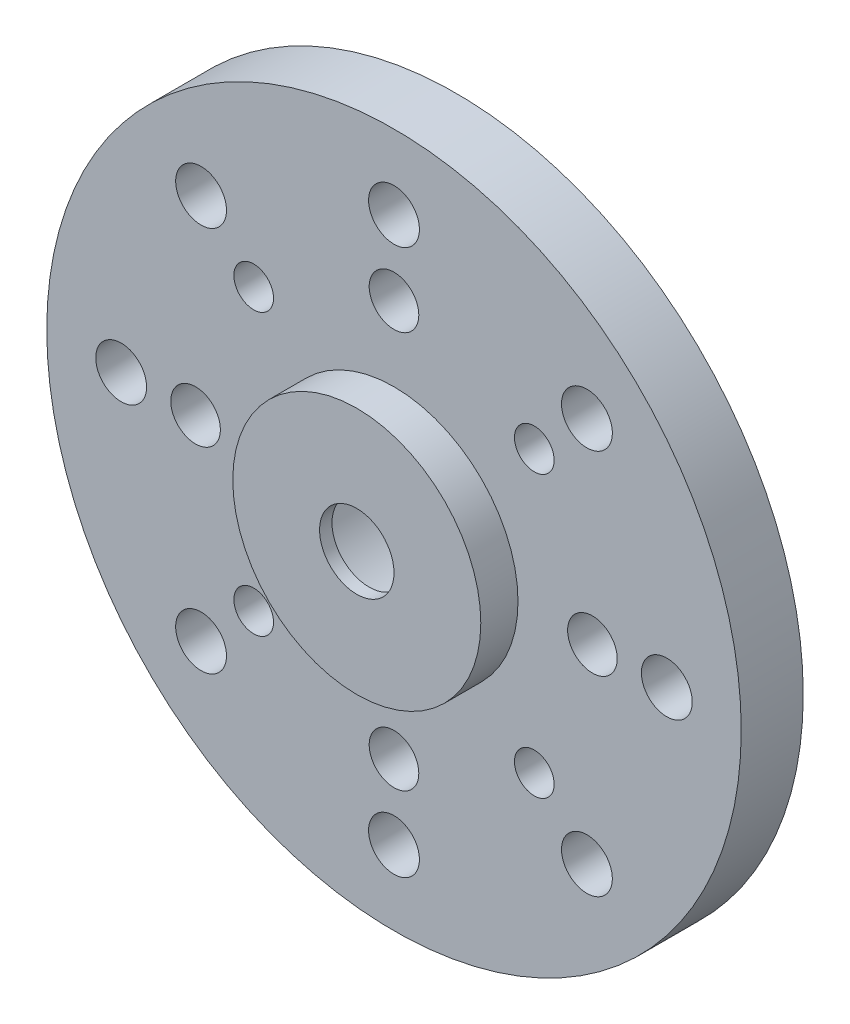
ISO-10303-21;
HEADER;
FILE_DESCRIPTION(('STEP AP214'),'2;1');
FILE_NAME('part.step','',(''),(''),'','','');
FILE_SCHEMA(('AUTOMOTIVE_DESIGN { 1 0 10303 214 1 1 1 1 }'));
ENDSEC;
DATA;
#1=APPLICATION_CONTEXT('core data for automotive mechanical design processes');
#2=APPLICATION_PROTOCOL_DEFINITION('international standard','automotive_design',2000,#1);
#3=PRODUCT_CONTEXT('',#1,'mechanical');
#4=PRODUCT('Part','Part','',(#3));
#5=PRODUCT_RELATED_PRODUCT_CATEGORY('part','',(#4));
#6=PRODUCT_DEFINITION_FORMATION('','',#4);
#7=PRODUCT_DEFINITION_CONTEXT('part definition',#1,'design');
#8=PRODUCT_DEFINITION('design','',#6,#7);
#9=PRODUCT_DEFINITION_SHAPE('','',#8);
#10=(LENGTH_UNIT() NAMED_UNIT(*) SI_UNIT(.MILLI.,.METRE.));
#11=(NAMED_UNIT(*) PLANE_ANGLE_UNIT() SI_UNIT($,.RADIAN.));
#12=(NAMED_UNIT(*) SI_UNIT($,.STERADIAN.) SOLID_ANGLE_UNIT());
#13=UNCERTAINTY_MEASURE_WITH_UNIT(LENGTH_MEASURE(1.E-05),#10,'distance_accuracy_value','');
#14=(GEOMETRIC_REPRESENTATION_CONTEXT(3) GLOBAL_UNCERTAINTY_ASSIGNED_CONTEXT((#13)) GLOBAL_UNIT_ASSIGNED_CONTEXT((#10,
#11,#12)) REPRESENTATION_CONTEXT('',''));
#15=CARTESIAN_POINT('',(0.,0.,0.));
#16=DIRECTION('',(0.,0.,1.));
#17=DIRECTION('',(1.,0.,0.));
#18=AXIS2_PLACEMENT_3D('',#15,#16,#17);
#19=CARTESIAN_POINT('',(0.,0.,25.));
#20=DIRECTION('',(0.,0.,1.));
#21=DIRECTION('',(1.,0.,0.));
#22=AXIS2_PLACEMENT_3D('',#19,#20,#21);
#23=CYLINDRICAL_SURFACE('',#22,1.5);
#24=CARTESIAN_POINT('',(0.,0.,25.));
#25=DIRECTION('',(0.,0.,1.));
#26=DIRECTION('',(1.,0.,0.));
#27=AXIS2_PLACEMENT_3D('',#24,#25,#26);
#28=CIRCLE('',#27,1.5);
#29=CARTESIAN_POINT('',(1.5,0.,25.));
#30=VERTEX_POINT('',#29);
#31=EDGE_CURVE('E133',#30,#30,#28,.T.);
#32=ORIENTED_EDGE('',*,*,#31,.T.);
#33=EDGE_LOOP('',(#32));
#34=FACE_BOUND('',#33,.T.);
#35=CARTESIAN_POINT('',(0.,0.,24.5));
#36=DIRECTION('',(0.,0.,-1.));
#37=DIRECTION('',(-1.,0.,0.));
#38=AXIS2_PLACEMENT_3D('',#35,#36,#37);
#39=CIRCLE('',#38,1.5);
#40=CARTESIAN_POINT('',(-1.5,0.,24.5));
#41=VERTEX_POINT('',#40);
#42=EDGE_CURVE('E37',#41,#41,#39,.F.);
#43=ORIENTED_EDGE('',*,*,#42,.F.);
#44=EDGE_LOOP('',(#43));
#45=FACE_BOUND('',#44,.T.);
#46=ADVANCED_FACE('F33',(#34,#45),#23,.F.);
#47=CARTESIAN_POINT('',(0.,0.,20.5));
#48=DIRECTION('',(0.,0.,-1.));
#49=DIRECTION('',(-1.,0.,0.));
#50=AXIS2_PLACEMENT_3D('',#47,#48,#49);
#51=PLANE('',#50);
#52=CARTESIAN_POINT('',(0.,0.,20.5));
#53=DIRECTION('',(0.,0.,-1.));
#54=DIRECTION('',(-1.,0.,0.));
#55=AXIS2_PLACEMENT_3D('',#52,#53,#54);
#56=CIRCLE('',#55,3.5);
#57=CARTESIAN_POINT('',(-3.5,0.,20.5));
#58=VERTEX_POINT('',#57);
#59=EDGE_CURVE('E447',#58,#58,#56,.T.);
#60=ORIENTED_EDGE('',*,*,#59,.F.);
#61=EDGE_LOOP('',(#60));
#62=FACE_BOUND('',#61,.T.);
#63=CARTESIAN_POINT('',(0.,0.,20.5));
#64=DIRECTION('',(0.,0.,-1.));
#65=DIRECTION('',(-1.,0.,0.));
#66=AXIS2_PLACEMENT_3D('',#63,#64,#65);
#67=CIRCLE('',#66,5.5);
#68=CARTESIAN_POINT('',(-5.5,0.,20.5));
#69=VERTEX_POINT('',#68);
#70=EDGE_CURVE('E10',#69,#69,#67,.T.);
#71=ORIENTED_EDGE('',*,*,#70,.T.);
#72=EDGE_LOOP('',(#71));
#73=FACE_BOUND('',#72,.T.);
#74=ADVANCED_FACE('F35',(#62,#73),#51,.T.);
#75=CARTESIAN_POINT('',(0.,0.,24.5164044156825));
#76=DIRECTION('',(0.,0.,-1.));
#77=DIRECTION('',(-1.,0.,0.));
#78=AXIS2_PLACEMENT_3D('',#75,#76,#77);
#79=CYLINDRICAL_SURFACE('',#78,5.5);
#80=CARTESIAN_POINT('',(0.,0.,21.));
#81=DIRECTION('',(0.,0.,-1.));
#82=DIRECTION('',(-1.,0.,0.));
#83=AXIS2_PLACEMENT_3D('',#80,#81,#82);
#84=CIRCLE('',#83,5.5);
#85=CARTESIAN_POINT('',(-5.5,0.,21.));
#86=VERTEX_POINT('',#85);
#87=EDGE_CURVE('E41',#86,#86,#84,.T.);
#88=ORIENTED_EDGE('',*,*,#87,.T.);
#89=EDGE_LOOP('',(#88));
#90=FACE_BOUND('',#89,.T.);
#91=ORIENTED_EDGE('',*,*,#70,.F.);
#92=EDGE_LOOP('',(#91));
#93=FACE_BOUND('',#92,.T.);
#94=ADVANCED_FACE('F162',(#90,#93),#79,.T.);
#95=CARTESIAN_POINT('',(5.5,0.,21.));
#96=DIRECTION('',(0.,0.,-1.));
#97=DIRECTION('',(-1.,0.,0.));
#98=AXIS2_PLACEMENT_3D('',#95,#96,#97);
#99=PLANE('',#98);
#100=CARTESIAN_POINT('',(-5.65685424949239,-5.65685424949237,21.));
#101=DIRECTION('',(0.,0.,-1.));
#102=DIRECTION('',(1.,0.,0.));
#103=AXIS2_PLACEMENT_3D('',#100,#101,#102);
#104=CIRCLE('',#103,0.799999999999999);
#105=CARTESIAN_POINT('',(-4.85685424949239,-5.65685424949237,21.));
#106=VERTEX_POINT('',#105);
#107=EDGE_CURVE('E451',#106,#106,#104,.T.);
#108=ORIENTED_EDGE('',*,*,#107,.F.);
#109=EDGE_LOOP('',(#108));
#110=FACE_BOUND('',#109,.T.);
#111=CARTESIAN_POINT('',(-5.65685424949231,5.65685424949245,21.));
#112=DIRECTION('',(0.,0.,-1.));
#113=DIRECTION('',(0.,-1.,0.));
#114=AXIS2_PLACEMENT_3D('',#111,#112,#113);
#115=CIRCLE('',#114,0.799999999999999);
#116=CARTESIAN_POINT('',(-5.65685424949232,4.85685424949245,21.));
#117=VERTEX_POINT('',#116);
#118=EDGE_CURVE('E459',#117,#117,#115,.T.);
#119=ORIENTED_EDGE('',*,*,#118,.F.);
#120=EDGE_LOOP('',(#119));
#121=FACE_BOUND('',#120,.T.);
#122=CARTESIAN_POINT('',(5.65685424949235,-5.65685424949241,21.));
#123=DIRECTION('',(0.,0.,-1.));
#124=DIRECTION('',(0.,1.,0.));
#125=AXIS2_PLACEMENT_3D('',#122,#123,#124);
#126=CIRCLE('',#125,0.799999999999999);
#127=CARTESIAN_POINT('',(5.65685424949235,-4.85685424949241,21.));
#128=VERTEX_POINT('',#127);
#129=EDGE_CURVE('E458',#128,#128,#126,.T.);
#130=ORIENTED_EDGE('',*,*,#129,.F.);
#131=EDGE_LOOP('',(#130));
#132=FACE_BOUND('',#131,.T.);
#133=CARTESIAN_POINT('',(5.65685424949239,5.65685424949237,21.));
#134=DIRECTION('',(0.,0.,-1.));
#135=DIRECTION('',(-1.,0.,0.));
#136=AXIS2_PLACEMENT_3D('',#133,#134,#135);
#137=CIRCLE('',#136,0.799999999999999);
#138=CARTESIAN_POINT('',(4.85685424949239,5.65685424949237,21.));
#139=VERTEX_POINT('',#138);
#140=EDGE_CURVE('E64',#139,#139,#137,.T.);
#141=ORIENTED_EDGE('',*,*,#140,.F.);
#142=EDGE_LOOP('',(#141));
#143=FACE_BOUND('',#142,.T.);
#144=CARTESIAN_POINT('',(0.,8.,21.));
#145=DIRECTION('',(0.,0.,-1.));
#146=DIRECTION('',(-1.,0.,0.));
#147=AXIS2_PLACEMENT_3D('',#144,#145,#146);
#148=CIRCLE('',#147,0.999999999999999);
#149=CARTESIAN_POINT('',(-0.999999999999999,8.,21.));
#150=VERTEX_POINT('',#149);
#151=EDGE_CURVE('E61',#150,#150,#148,.T.);
#152=ORIENTED_EDGE('',*,*,#151,.F.);
#153=EDGE_LOOP('',(#152));
#154=FACE_BOUND('',#153,.T.);
#155=CARTESIAN_POINT('',(8.,0.,21.));
#156=DIRECTION('',(0.,0.,-1.));
#157=DIRECTION('',(-1.,0.,0.));
#158=AXIS2_PLACEMENT_3D('',#155,#156,#157);
#159=CIRCLE('',#158,0.999999999999999);
#160=CARTESIAN_POINT('',(7.,0.,21.));
#161=VERTEX_POINT('',#160);
#162=EDGE_CURVE('E58',#161,#161,#159,.T.);
#163=ORIENTED_EDGE('',*,*,#162,.F.);
#164=EDGE_LOOP('',(#163));
#165=FACE_BOUND('',#164,.T.);
#166=CARTESIAN_POINT('',(0.,-8.,21.));
#167=DIRECTION('',(0.,0.,-1.));
#168=DIRECTION('',(-1.,0.,0.));
#169=AXIS2_PLACEMENT_3D('',#166,#167,#168);
#170=CIRCLE('',#169,0.999999999999999);
#171=CARTESIAN_POINT('',(-0.999999999999999,-8.,21.));
#172=VERTEX_POINT('',#171);
#173=EDGE_CURVE('E54',#172,#172,#170,.T.);
#174=ORIENTED_EDGE('',*,*,#173,.F.);
#175=EDGE_LOOP('',(#174));
#176=FACE_BOUND('',#175,.T.);
#177=CARTESIAN_POINT('',(-8.,0.,21.));
#178=DIRECTION('',(0.,0.,-1.));
#179=DIRECTION('',(-1.,0.,0.));
#180=AXIS2_PLACEMENT_3D('',#177,#178,#179);
#181=CIRCLE('',#180,0.999999999999999);
#182=CARTESIAN_POINT('',(-9.,0.,21.));
#183=VERTEX_POINT('',#182);
#184=EDGE_CURVE('E50',#183,#183,#181,.T.);
#185=ORIENTED_EDGE('',*,*,#184,.F.);
#186=EDGE_LOOP('',(#185));
#187=FACE_BOUND('',#186,.T.);
#188=CARTESIAN_POINT('',(11.,0.,21.));
#189=DIRECTION('',(0.,0.,-1.));
#190=DIRECTION('',(0.,1.,0.));
#191=AXIS2_PLACEMENT_3D('',#188,#189,#190);
#192=CIRCLE('',#191,1.025);
#193=CARTESIAN_POINT('',(11.,1.02499999999996,21.));
#194=VERTEX_POINT('',#193);
#195=EDGE_CURVE('E86',#194,#194,#192,.T.);
#196=ORIENTED_EDGE('',*,*,#195,.F.);
#197=EDGE_LOOP('',(#196));
#198=FACE_BOUND('',#197,.T.);
#199=CARTESIAN_POINT('',(7.77817459305198,-7.77817459305206,21.));
#200=DIRECTION('',(0.,0.,-1.));
#201=DIRECTION('',(0.707106781186551,0.707106781186544,0.));
#202=AXIS2_PLACEMENT_3D('',#199,#200,#201);
#203=CIRCLE('',#202,1.025);
#204=CARTESIAN_POINT('',(8.5029590437682,-7.05339014233586,21.));
#205=VERTEX_POINT('',#204);
#206=EDGE_CURVE('E94',#205,#205,#203,.T.);
#207=ORIENTED_EDGE('',*,*,#206,.F.);
#208=EDGE_LOOP('',(#207));
#209=FACE_BOUND('',#208,.T.);
#210=CARTESIAN_POINT('',(0.,-11.,21.));
#211=DIRECTION('',(0.,0.,-1.));
#212=DIRECTION('',(1.,0.,0.));
#213=AXIS2_PLACEMENT_3D('',#210,#211,#212);
#214=CIRCLE('',#213,1.025);
#215=CARTESIAN_POINT('',(1.025,-11.,21.));
#216=VERTEX_POINT('',#215);
#217=EDGE_CURVE('E100',#216,#216,#214,.T.);
#218=ORIENTED_EDGE('',*,*,#217,.F.);
#219=EDGE_LOOP('',(#218));
#220=FACE_BOUND('',#219,.T.);
#221=CARTESIAN_POINT('',(-7.77817459305209,-7.77817459305195,21.));
#222=DIRECTION('',(0.,0.,-1.));
#223=DIRECTION('',(0.707106781186541,-0.707106781186554,0.));
#224=AXIS2_PLACEMENT_3D('',#221,#222,#223);
#225=CIRCLE('',#224,1.025);
#226=CARTESIAN_POINT('',(-7.05339014233588,-8.50295904376817,21.));
#227=VERTEX_POINT('',#226);
#228=EDGE_CURVE('E106',#227,#227,#225,.T.);
#229=ORIENTED_EDGE('',*,*,#228,.F.);
#230=EDGE_LOOP('',(#229));
#231=FACE_BOUND('',#230,.T.);
#232=CARTESIAN_POINT('',(-11.,1.15218884181823E-13,21.));
#233=DIRECTION('',(0.,0.,-1.));
#234=DIRECTION('',(0.,-1.,0.));
#235=AXIS2_PLACEMENT_3D('',#232,#233,#234);
#236=CIRCLE('',#235,1.025);
#237=CARTESIAN_POINT('',(-11.,-1.02499999999988,21.));
#238=VERTEX_POINT('',#237);
#239=EDGE_CURVE('E112',#238,#238,#236,.T.);
#240=ORIENTED_EDGE('',*,*,#239,.F.);
#241=EDGE_LOOP('',(#240));
#242=FACE_BOUND('',#241,.T.);
#243=CARTESIAN_POINT('',(-7.77817459305193,7.77817459305212,21.));
#244=DIRECTION('',(0.,0.,-1.));
#245=DIRECTION('',(-0.707106781186556,-0.707106781186539,0.));
#246=AXIS2_PLACEMENT_3D('',#243,#244,#245);
#247=CIRCLE('',#246,1.025);
#248=CARTESIAN_POINT('',(-8.50295904376815,7.05339014233591,21.));
#249=VERTEX_POINT('',#248);
#250=EDGE_CURVE('E85',#249,#249,#247,.T.);
#251=ORIENTED_EDGE('',*,*,#250,.F.);
#252=EDGE_LOOP('',(#251));
#253=FACE_BOUND('',#252,.T.);
#254=CARTESIAN_POINT('',(7.77817459305204,7.77817459305201,21.));
#255=DIRECTION('',(0.,0.,-1.));
#256=DIRECTION('',(-0.707106781186546,0.707106781186549,0.));
#257=AXIS2_PLACEMENT_3D('',#254,#255,#256);
#258=CIRCLE('',#257,1.025);
#259=CARTESIAN_POINT('',(7.05339014233583,8.50295904376822,21.));
#260=VERTEX_POINT('',#259);
#261=EDGE_CURVE('E93',#260,#260,#258,.T.);
#262=ORIENTED_EDGE('',*,*,#261,.F.);
#263=EDGE_LOOP('',(#262));
#264=FACE_BOUND('',#263,.T.);
#265=CARTESIAN_POINT('',(0.,11.,21.));
#266=DIRECTION('',(0.,0.,-1.));
#267=DIRECTION('',(-1.,0.,0.));
#268=AXIS2_PLACEMENT_3D('',#265,#266,#267);
#269=CIRCLE('',#268,1.025);
#270=CARTESIAN_POINT('',(-1.025,11.,21.));
#271=VERTEX_POINT('',#270);
#272=EDGE_CURVE('E130',#271,#271,#269,.T.);
#273=ORIENTED_EDGE('',*,*,#272,.F.);
#274=EDGE_LOOP('',(#273));
#275=FACE_BOUND('',#274,.T.);
#276=CARTESIAN_POINT('',(0.,0.,21.));
#277=DIRECTION('',(0.,0.,-1.));
#278=DIRECTION('',(-1.,0.,0.));
#279=AXIS2_PLACEMENT_3D('',#276,#277,#278);
#280=CIRCLE('',#279,14.);
#281=CARTESIAN_POINT('',(-14.,0.,21.));
#282=VERTEX_POINT('',#281);
#283=EDGE_CURVE('E46',#282,#282,#280,.T.);
#284=ORIENTED_EDGE('',*,*,#283,.T.);
#285=EDGE_LOOP('',(#284));
#286=FACE_BOUND('',#285,.T.);
#287=ORIENTED_EDGE('',*,*,#87,.F.);
#288=EDGE_LOOP('',(#287));
#289=FACE_BOUND('',#288,.T.);
#290=ADVANCED_FACE('F147',(#110,#121,#132,#143,#154,#165,#176,#187,#198,#209,#220,#231,#242,
#253,#264,#275,#286,#289),#99,.T.);
#291=CARTESIAN_POINT('',(0.,0.,24.5164044156825));
#292=DIRECTION('',(0.,0.,-1.));
#293=DIRECTION('',(-1.,0.,0.));
#294=AXIS2_PLACEMENT_3D('',#291,#292,#293);
#295=CYLINDRICAL_SURFACE('',#294,14.);
#296=CARTESIAN_POINT('',(0.,0.,23.5));
#297=DIRECTION('',(0.,0.,-1.));
#298=DIRECTION('',(-1.,0.,0.));
#299=AXIS2_PLACEMENT_3D('',#296,#297,#298);
#300=CIRCLE('',#299,14.);
#301=CARTESIAN_POINT('',(-14.,0.,23.5));
#302=VERTEX_POINT('',#301);
#303=EDGE_CURVE('E142',#302,#302,#300,.T.);
#304=ORIENTED_EDGE('',*,*,#303,.T.);
#305=EDGE_LOOP('',(#304));
#306=FACE_BOUND('',#305,.T.);
#307=ORIENTED_EDGE('',*,*,#283,.F.);
#308=EDGE_LOOP('',(#307));
#309=FACE_BOUND('',#308,.T.);
#310=ADVANCED_FACE('F150',(#306,#309),#295,.T.);
#311=CARTESIAN_POINT('',(14.,0.,23.5));
#312=DIRECTION('',(0.,0.,1.));
#313=DIRECTION('',(1.,0.,0.));
#314=AXIS2_PLACEMENT_3D('',#311,#312,#313);
#315=PLANE('',#314);
#316=CARTESIAN_POINT('',(-5.65685424949239,-5.65685424949237,23.5));
#317=DIRECTION('',(0.,0.,1.));
#318=DIRECTION('',(-1.,0.,0.));
#319=AXIS2_PLACEMENT_3D('',#316,#317,#318);
#320=CIRCLE('',#319,0.799999999999999);
#321=CARTESIAN_POINT('',(-6.45685424949239,-5.65685424949237,23.5));
#322=VERTEX_POINT('',#321);
#323=EDGE_CURVE('E454',#322,#322,#320,.T.);
#324=ORIENTED_EDGE('',*,*,#323,.F.);
#325=EDGE_LOOP('',(#324));
#326=FACE_BOUND('',#325,.T.);
#327=CARTESIAN_POINT('',(-5.65685424949231,5.65685424949245,23.5));
#328=DIRECTION('',(0.,0.,1.));
#329=DIRECTION('',(0.,1.,0.));
#330=AXIS2_PLACEMENT_3D('',#327,#328,#329);
#331=CIRCLE('',#330,0.799999999999999);
#332=CARTESIAN_POINT('',(-5.6568542494923,6.45685424949245,23.5));
#333=VERTEX_POINT('',#332);
#334=EDGE_CURVE('E455',#333,#333,#331,.T.);
#335=ORIENTED_EDGE('',*,*,#334,.F.);
#336=EDGE_LOOP('',(#335));
#337=FACE_BOUND('',#336,.T.);
#338=CARTESIAN_POINT('',(5.65685424949235,-5.65685424949241,23.5));
#339=DIRECTION('',(0.,0.,1.));
#340=DIRECTION('',(0.,-1.,0.));
#341=AXIS2_PLACEMENT_3D('',#338,#339,#340);
#342=CIRCLE('',#341,0.799999999999999);
#343=CARTESIAN_POINT('',(5.65685424949235,-6.45685424949241,23.5));
#344=VERTEX_POINT('',#343);
#345=EDGE_CURVE('E75',#344,#344,#342,.T.);
#346=ORIENTED_EDGE('',*,*,#345,.F.);
#347=EDGE_LOOP('',(#346));
#348=FACE_BOUND('',#347,.T.);
#349=CARTESIAN_POINT('',(5.65685424949239,5.65685424949237,23.5));
#350=DIRECTION('',(0.,0.,1.));
#351=DIRECTION('',(1.,0.,0.));
#352=AXIS2_PLACEMENT_3D('',#349,#350,#351);
#353=CIRCLE('',#352,0.799999999999999);
#354=CARTESIAN_POINT('',(6.45685424949239,5.65685424949237,23.5));
#355=VERTEX_POINT('',#354);
#356=EDGE_CURVE('E70',#355,#355,#353,.T.);
#357=ORIENTED_EDGE('',*,*,#356,.F.);
#358=EDGE_LOOP('',(#357));
#359=FACE_BOUND('',#358,.T.);
#360=CARTESIAN_POINT('',(0.,8.,23.5));
#361=DIRECTION('',(0.,0.,1.));
#362=DIRECTION('',(1.,0.,0.));
#363=AXIS2_PLACEMENT_3D('',#360,#361,#362);
#364=CIRCLE('',#363,0.999999999999999);
#365=CARTESIAN_POINT('',(0.999999999999999,8.,23.5));
#366=VERTEX_POINT('',#365);
#367=EDGE_CURVE('E62',#366,#366,#364,.T.);
#368=ORIENTED_EDGE('',*,*,#367,.F.);
#369=EDGE_LOOP('',(#368));
#370=FACE_BOUND('',#369,.T.);
#371=CARTESIAN_POINT('',(8.,0.,23.5));
#372=DIRECTION('',(0.,0.,1.));
#373=DIRECTION('',(1.,0.,0.));
#374=AXIS2_PLACEMENT_3D('',#371,#372,#373);
#375=CIRCLE('',#374,0.999999999999999);
#376=CARTESIAN_POINT('',(9.,0.,23.5));
#377=VERTEX_POINT('',#376);
#378=EDGE_CURVE('E59',#377,#377,#375,.T.);
#379=ORIENTED_EDGE('',*,*,#378,.F.);
#380=EDGE_LOOP('',(#379));
#381=FACE_BOUND('',#380,.T.);
#382=CARTESIAN_POINT('',(0.,-8.,23.5));
#383=DIRECTION('',(0.,0.,1.));
#384=DIRECTION('',(1.,0.,0.));
#385=AXIS2_PLACEMENT_3D('',#382,#383,#384);
#386=CIRCLE('',#385,0.999999999999999);
#387=CARTESIAN_POINT('',(0.999999999999999,-8.,23.5));
#388=VERTEX_POINT('',#387);
#389=EDGE_CURVE('E55',#388,#388,#386,.T.);
#390=ORIENTED_EDGE('',*,*,#389,.F.);
#391=EDGE_LOOP('',(#390));
#392=FACE_BOUND('',#391,.T.);
#393=CARTESIAN_POINT('',(-8.,0.,23.5));
#394=DIRECTION('',(0.,0.,1.));
#395=DIRECTION('',(1.,0.,0.));
#396=AXIS2_PLACEMENT_3D('',#393,#394,#395);
#397=CIRCLE('',#396,0.999999999999999);
#398=CARTESIAN_POINT('',(-7.,0.,23.5));
#399=VERTEX_POINT('',#398);
#400=EDGE_CURVE('E53',#399,#399,#397,.T.);
#401=ORIENTED_EDGE('',*,*,#400,.F.);
#402=EDGE_LOOP('',(#401));
#403=FACE_BOUND('',#402,.T.);
#404=CARTESIAN_POINT('',(11.,0.,23.5));
#405=DIRECTION('',(0.,0.,1.));
#406=DIRECTION('',(0.,-1.,0.));
#407=AXIS2_PLACEMENT_3D('',#404,#405,#406);
#408=CIRCLE('',#407,1.025);
#409=CARTESIAN_POINT('',(11.,-1.02500000000004,23.5));
#410=VERTEX_POINT('',#409);
#411=EDGE_CURVE('E89',#410,#410,#408,.T.);
#412=ORIENTED_EDGE('',*,*,#411,.F.);
#413=EDGE_LOOP('',(#412));
#414=FACE_BOUND('',#413,.T.);
#415=CARTESIAN_POINT('',(7.77817459305198,-7.77817459305206,23.5));
#416=DIRECTION('',(0.,0.,1.));
#417=DIRECTION('',(-0.707106781186551,-0.707106781186544,0.));
#418=AXIS2_PLACEMENT_3D('',#415,#416,#417);
#419=CIRCLE('',#418,1.025);
#420=CARTESIAN_POINT('',(7.05339014233577,-8.50295904376827,23.5));
#421=VERTEX_POINT('',#420);
#422=EDGE_CURVE('E90',#421,#421,#419,.T.);
#423=ORIENTED_EDGE('',*,*,#422,.F.);
#424=EDGE_LOOP('',(#423));
#425=FACE_BOUND('',#424,.T.);
#426=CARTESIAN_POINT('',(0.,-11.,23.5));
#427=DIRECTION('',(0.,0.,1.));
#428=DIRECTION('',(-1.,0.,0.));
#429=AXIS2_PLACEMENT_3D('',#426,#427,#428);
#430=CIRCLE('',#429,1.025);
#431=CARTESIAN_POINT('',(-1.025,-11.,23.5));
#432=VERTEX_POINT('',#431);
#433=EDGE_CURVE('E97',#432,#432,#430,.T.);
#434=ORIENTED_EDGE('',*,*,#433,.F.);
#435=EDGE_LOOP('',(#434));
#436=FACE_BOUND('',#435,.T.);
#437=CARTESIAN_POINT('',(-7.77817459305209,-7.77817459305195,23.5));
#438=DIRECTION('',(0.,0.,1.));
#439=DIRECTION('',(-0.707106781186541,0.707106781186554,0.));
#440=AXIS2_PLACEMENT_3D('',#437,#438,#439);
#441=CIRCLE('',#440,1.025);
#442=CARTESIAN_POINT('',(-8.50295904376829,-7.05339014233574,23.5));
#443=VERTEX_POINT('',#442);
#444=EDGE_CURVE('E103',#443,#443,#441,.T.);
#445=ORIENTED_EDGE('',*,*,#444,.F.);
#446=EDGE_LOOP('',(#445));
#447=FACE_BOUND('',#446,.T.);
#448=CARTESIAN_POINT('',(-11.,1.15218884181823E-13,23.5));
#449=DIRECTION('',(0.,0.,1.));
#450=DIRECTION('',(0.,1.,0.));
#451=AXIS2_PLACEMENT_3D('',#448,#449,#450);
#452=CIRCLE('',#451,1.025);
#453=CARTESIAN_POINT('',(-11.,1.02500000000011,23.5));
#454=VERTEX_POINT('',#453);
#455=EDGE_CURVE('E109',#454,#454,#452,.T.);
#456=ORIENTED_EDGE('',*,*,#455,.F.);
#457=EDGE_LOOP('',(#456));
#458=FACE_BOUND('',#457,.T.);
#459=CARTESIAN_POINT('',(-7.77817459305193,7.77817459305212,23.5));
#460=DIRECTION('',(0.,0.,1.));
#461=DIRECTION('',(0.707106781186556,0.707106781186539,0.));
#462=AXIS2_PLACEMENT_3D('',#459,#460,#461);
#463=CIRCLE('',#462,1.025);
#464=CARTESIAN_POINT('',(-7.05339014233571,8.50295904376832,23.5));
#465=VERTEX_POINT('',#464);
#466=EDGE_CURVE('E115',#465,#465,#463,.T.);
#467=ORIENTED_EDGE('',*,*,#466,.F.);
#468=EDGE_LOOP('',(#467));
#469=FACE_BOUND('',#468,.T.);
#470=CARTESIAN_POINT('',(7.77817459305204,7.77817459305201,23.5));
#471=DIRECTION('',(0.,0.,1.));
#472=DIRECTION('',(0.707106781186546,-0.707106781186549,0.));
#473=AXIS2_PLACEMENT_3D('',#470,#471,#472);
#474=CIRCLE('',#473,1.025);
#475=CARTESIAN_POINT('',(8.50295904376824,7.0533901423358,23.5));
#476=VERTEX_POINT('',#475);
#477=EDGE_CURVE('E124',#476,#476,#474,.T.);
#478=ORIENTED_EDGE('',*,*,#477,.F.);
#479=EDGE_LOOP('',(#478));
#480=FACE_BOUND('',#479,.T.);
#481=CARTESIAN_POINT('',(0.,11.,23.5));
#482=DIRECTION('',(0.,0.,1.));
#483=DIRECTION('',(1.,0.,0.));
#484=AXIS2_PLACEMENT_3D('',#481,#482,#483);
#485=CIRCLE('',#484,1.025);
#486=CARTESIAN_POINT('',(1.025,11.,23.5));
#487=VERTEX_POINT('',#486);
#488=EDGE_CURVE('E127',#487,#487,#485,.T.);
#489=ORIENTED_EDGE('',*,*,#488,.F.);
#490=EDGE_LOOP('',(#489));
#491=FACE_BOUND('',#490,.T.);
#492=CARTESIAN_POINT('',(0.,0.,23.5));
#493=DIRECTION('',(0.,0.,-1.));
#494=DIRECTION('',(-1.,0.,0.));
#495=AXIS2_PLACEMENT_3D('',#492,#493,#494);
#496=CIRCLE('',#495,5.);
#497=CARTESIAN_POINT('',(-5.,0.,23.5));
#498=VERTEX_POINT('',#497);
#499=EDGE_CURVE('E139',#498,#498,#496,.T.);
#500=ORIENTED_EDGE('',*,*,#499,.T.);
#501=EDGE_LOOP('',(#500));
#502=FACE_BOUND('',#501,.T.);
#503=ORIENTED_EDGE('',*,*,#303,.F.);
#504=EDGE_LOOP('',(#503));
#505=FACE_BOUND('',#504,.T.);
#506=ADVANCED_FACE('F152',(#326,#337,#348,#359,#370,#381,#392,#403,#414,#425,#436,#447,#458,
#469,#480,#491,#502,#505),#315,.T.);
#507=CARTESIAN_POINT('',(0.,0.,24.5164044156825));
#508=DIRECTION('',(0.,0.,-1.));
#509=DIRECTION('',(-1.,0.,0.));
#510=AXIS2_PLACEMENT_3D('',#507,#508,#509);
#511=CYLINDRICAL_SURFACE('',#510,5.);
#512=CARTESIAN_POINT('',(0.,0.,25.));
#513=DIRECTION('',(0.,0.,-1.));
#514=DIRECTION('',(-1.,0.,0.));
#515=AXIS2_PLACEMENT_3D('',#512,#513,#514);
#516=CIRCLE('',#515,5.);
#517=CARTESIAN_POINT('',(-5.,0.,25.));
#518=VERTEX_POINT('',#517);
#519=EDGE_CURVE('E136',#518,#518,#516,.T.);
#520=ORIENTED_EDGE('',*,*,#519,.T.);
#521=EDGE_LOOP('',(#520));
#522=FACE_BOUND('',#521,.T.);
#523=ORIENTED_EDGE('',*,*,#499,.F.);
#524=EDGE_LOOP('',(#523));
#525=FACE_BOUND('',#524,.T.);
#526=ADVANCED_FACE('F159',(#522,#525),#511,.T.);
#527=CARTESIAN_POINT('',(5.,0.,25.));
#528=DIRECTION('',(0.,0.,1.));
#529=DIRECTION('',(1.,0.,0.));
#530=AXIS2_PLACEMENT_3D('',#527,#528,#529);
#531=PLANE('',#530);
#532=ORIENTED_EDGE('',*,*,#31,.F.);
#533=EDGE_LOOP('',(#532));
#534=FACE_BOUND('',#533,.T.);
#535=ORIENTED_EDGE('',*,*,#519,.F.);
#536=EDGE_LOOP('',(#535));
#537=FACE_BOUND('',#536,.T.);
#538=ADVANCED_FACE('F177',(#534,#537),#531,.T.);
#539=CARTESIAN_POINT('',(0.,11.,23.5));
#540=DIRECTION('',(0.,0.,1.));
#541=DIRECTION('',(1.,0.,0.));
#542=AXIS2_PLACEMENT_3D('',#539,#540,#541);
#543=CYLINDRICAL_SURFACE('',#542,1.025);
#544=ORIENTED_EDGE('',*,*,#272,.T.);
#545=EDGE_LOOP('',(#544));
#546=FACE_BOUND('',#545,.T.);
#547=ORIENTED_EDGE('',*,*,#488,.T.);
#548=EDGE_LOOP('',(#547));
#549=FACE_BOUND('',#548,.T.);
#550=ADVANCED_FACE('F175',(#546,#549),#543,.F.);
#551=CARTESIAN_POINT('',(7.77817459305204,7.77817459305201,23.5));
#552=DIRECTION('',(0.,0.,1.));
#553=DIRECTION('',(0.707106781186546,-0.707106781186549,0.));
#554=AXIS2_PLACEMENT_3D('',#551,#552,#553);
#555=CYLINDRICAL_SURFACE('',#554,1.025);
#556=ORIENTED_EDGE('',*,*,#261,.T.);
#557=EDGE_LOOP('',(#556));
#558=FACE_BOUND('',#557,.T.);
#559=ORIENTED_EDGE('',*,*,#477,.T.);
#560=EDGE_LOOP('',(#559));
#561=FACE_BOUND('',#560,.T.);
#562=ADVANCED_FACE('F205',(#558,#561),#555,.F.);
#563=CARTESIAN_POINT('',(-7.77817459305193,7.77817459305212,23.5));
#564=DIRECTION('',(0.,0.,1.));
#565=DIRECTION('',(0.707106781186556,0.707106781186539,0.));
#566=AXIS2_PLACEMENT_3D('',#563,#564,#565);
#567=CYLINDRICAL_SURFACE('',#566,1.025);
#568=ORIENTED_EDGE('',*,*,#250,.T.);
#569=EDGE_LOOP('',(#568));
#570=FACE_BOUND('',#569,.T.);
#571=ORIENTED_EDGE('',*,*,#466,.T.);
#572=EDGE_LOOP('',(#571));
#573=FACE_BOUND('',#572,.T.);
#574=ADVANCED_FACE('F212',(#570,#573),#567,.F.);
#575=CARTESIAN_POINT('',(-11.,1.15218884181823E-13,23.5));
#576=DIRECTION('',(0.,0.,1.));
#577=DIRECTION('',(0.,1.,0.));
#578=AXIS2_PLACEMENT_3D('',#575,#576,#577);
#579=CYLINDRICAL_SURFACE('',#578,1.025);
#580=ORIENTED_EDGE('',*,*,#239,.T.);
#581=EDGE_LOOP('',(#580));
#582=FACE_BOUND('',#581,.T.);
#583=ORIENTED_EDGE('',*,*,#455,.T.);
#584=EDGE_LOOP('',(#583));
#585=FACE_BOUND('',#584,.T.);
#586=ADVANCED_FACE('F220',(#582,#585),#579,.F.);
#587=CARTESIAN_POINT('',(-7.77817459305209,-7.77817459305195,23.5));
#588=DIRECTION('',(0.,0.,1.));
#589=DIRECTION('',(-0.707106781186541,0.707106781186554,0.));
#590=AXIS2_PLACEMENT_3D('',#587,#588,#589);
#591=CYLINDRICAL_SURFACE('',#590,1.025);
#592=ORIENTED_EDGE('',*,*,#228,.T.);
#593=EDGE_LOOP('',(#592));
#594=FACE_BOUND('',#593,.T.);
#595=ORIENTED_EDGE('',*,*,#444,.T.);
#596=EDGE_LOOP('',(#595));
#597=FACE_BOUND('',#596,.T.);
#598=ADVANCED_FACE('F229',(#594,#597),#591,.F.);
#599=CARTESIAN_POINT('',(0.,-11.,23.5));
#600=DIRECTION('',(0.,0.,1.));
#601=DIRECTION('',(-1.,0.,0.));
#602=AXIS2_PLACEMENT_3D('',#599,#600,#601);
#603=CYLINDRICAL_SURFACE('',#602,1.025);
#604=ORIENTED_EDGE('',*,*,#217,.T.);
#605=EDGE_LOOP('',(#604));
#606=FACE_BOUND('',#605,.T.);
#607=ORIENTED_EDGE('',*,*,#433,.T.);
#608=EDGE_LOOP('',(#607));
#609=FACE_BOUND('',#608,.T.);
#610=ADVANCED_FACE('F237',(#606,#609),#603,.F.);
#611=CARTESIAN_POINT('',(7.77817459305198,-7.77817459305206,23.5));
#612=DIRECTION('',(0.,0.,1.));
#613=DIRECTION('',(-0.707106781186551,-0.707106781186544,0.));
#614=AXIS2_PLACEMENT_3D('',#611,#612,#613);
#615=CYLINDRICAL_SURFACE('',#614,1.025);
#616=ORIENTED_EDGE('',*,*,#206,.T.);
#617=EDGE_LOOP('',(#616));
#618=FACE_BOUND('',#617,.T.);
#619=ORIENTED_EDGE('',*,*,#422,.T.);
#620=EDGE_LOOP('',(#619));
#621=FACE_BOUND('',#620,.T.);
#622=ADVANCED_FACE('F245',(#618,#621),#615,.F.);
#623=CARTESIAN_POINT('',(11.,0.,23.5));
#624=DIRECTION('',(0.,0.,1.));
#625=DIRECTION('',(0.,-1.,0.));
#626=AXIS2_PLACEMENT_3D('',#623,#624,#625);
#627=CYLINDRICAL_SURFACE('',#626,1.025);
#628=ORIENTED_EDGE('',*,*,#195,.T.);
#629=EDGE_LOOP('',(#628));
#630=FACE_BOUND('',#629,.T.);
#631=ORIENTED_EDGE('',*,*,#411,.T.);
#632=EDGE_LOOP('',(#631));
#633=FACE_BOUND('',#632,.T.);
#634=ADVANCED_FACE('F253',(#630,#633),#627,.F.);
#635=CARTESIAN_POINT('',(-8.,0.,25.));
#636=DIRECTION('',(0.,0.,1.));
#637=DIRECTION('',(1.,0.,0.));
#638=AXIS2_PLACEMENT_3D('',#635,#636,#637);
#639=CYLINDRICAL_SURFACE('',#638,0.999999999999999);
#640=ORIENTED_EDGE('',*,*,#400,.T.);
#641=EDGE_LOOP('',(#640));
#642=FACE_BOUND('',#641,.T.);
#643=ORIENTED_EDGE('',*,*,#184,.T.);
#644=EDGE_LOOP('',(#643));
#645=FACE_BOUND('',#644,.T.);
#646=ADVANCED_FACE('F260',(#642,#645),#639,.F.);
#647=CARTESIAN_POINT('',(0.,-8.,25.));
#648=DIRECTION('',(0.,0.,1.));
#649=DIRECTION('',(1.,0.,0.));
#650=AXIS2_PLACEMENT_3D('',#647,#648,#649);
#651=CYLINDRICAL_SURFACE('',#650,0.999999999999999);
#652=ORIENTED_EDGE('',*,*,#173,.T.);
#653=EDGE_LOOP('',(#652));
#654=FACE_BOUND('',#653,.T.);
#655=ORIENTED_EDGE('',*,*,#389,.T.);
#656=EDGE_LOOP('',(#655));
#657=FACE_BOUND('',#656,.T.);
#658=ADVANCED_FACE('F268',(#654,#657),#651,.F.);
#659=CARTESIAN_POINT('',(8.,0.,25.));
#660=DIRECTION('',(0.,0.,1.));
#661=DIRECTION('',(1.,0.,0.));
#662=AXIS2_PLACEMENT_3D('',#659,#660,#661);
#663=CYLINDRICAL_SURFACE('',#662,0.999999999999999);
#664=ORIENTED_EDGE('',*,*,#162,.T.);
#665=EDGE_LOOP('',(#664));
#666=FACE_BOUND('',#665,.T.);
#667=ORIENTED_EDGE('',*,*,#378,.T.);
#668=EDGE_LOOP('',(#667));
#669=FACE_BOUND('',#668,.T.);
#670=ADVANCED_FACE('F276',(#666,#669),#663,.F.);
#671=CARTESIAN_POINT('',(0.,8.,25.));
#672=DIRECTION('',(0.,0.,1.));
#673=DIRECTION('',(1.,0.,0.));
#674=AXIS2_PLACEMENT_3D('',#671,#672,#673);
#675=CYLINDRICAL_SURFACE('',#674,0.999999999999999);
#676=ORIENTED_EDGE('',*,*,#151,.T.);
#677=EDGE_LOOP('',(#676));
#678=FACE_BOUND('',#677,.T.);
#679=ORIENTED_EDGE('',*,*,#367,.T.);
#680=EDGE_LOOP('',(#679));
#681=FACE_BOUND('',#680,.T.);
#682=ADVANCED_FACE('F284',(#678,#681),#675,.F.);
#683=CARTESIAN_POINT('',(5.65685424949239,5.65685424949237,23.5));
#684=DIRECTION('',(0.,0.,1.));
#685=DIRECTION('',(1.,0.,0.));
#686=AXIS2_PLACEMENT_3D('',#683,#684,#685);
#687=CYLINDRICAL_SURFACE('',#686,0.799999999999999);
#688=ORIENTED_EDGE('',*,*,#140,.T.);
#689=EDGE_LOOP('',(#688));
#690=FACE_BOUND('',#689,.T.);
#691=ORIENTED_EDGE('',*,*,#356,.T.);
#692=EDGE_LOOP('',(#691));
#693=FACE_BOUND('',#692,.T.);
#694=ADVANCED_FACE('F292',(#690,#693),#687,.F.);
#695=CARTESIAN_POINT('',(5.65685424949235,-5.65685424949241,23.5));
#696=DIRECTION('',(0.,0.,1.));
#697=DIRECTION('',(0.,-1.,0.));
#698=AXIS2_PLACEMENT_3D('',#695,#696,#697);
#699=CYLINDRICAL_SURFACE('',#698,0.799999999999999);
#700=ORIENTED_EDGE('',*,*,#129,.T.);
#701=EDGE_LOOP('',(#700));
#702=FACE_BOUND('',#701,.T.);
#703=ORIENTED_EDGE('',*,*,#345,.T.);
#704=EDGE_LOOP('',(#703));
#705=FACE_BOUND('',#704,.T.);
#706=ADVANCED_FACE('F300',(#702,#705),#699,.F.);
#707=CARTESIAN_POINT('',(-5.65685424949231,5.65685424949245,23.5));
#708=DIRECTION('',(0.,0.,1.));
#709=DIRECTION('',(0.,1.,0.));
#710=AXIS2_PLACEMENT_3D('',#707,#708,#709);
#711=CYLINDRICAL_SURFACE('',#710,0.799999999999999);
#712=ORIENTED_EDGE('',*,*,#118,.T.);
#713=EDGE_LOOP('',(#712));
#714=FACE_BOUND('',#713,.T.);
#715=ORIENTED_EDGE('',*,*,#334,.T.);
#716=EDGE_LOOP('',(#715));
#717=FACE_BOUND('',#716,.T.);
#718=ADVANCED_FACE('F305',(#714,#717),#711,.F.);
#719=CARTESIAN_POINT('',(-5.65685424949239,-5.65685424949237,23.5));
#720=DIRECTION('',(0.,0.,1.));
#721=DIRECTION('',(-1.,0.,0.));
#722=AXIS2_PLACEMENT_3D('',#719,#720,#721);
#723=CYLINDRICAL_SURFACE('',#722,0.799999999999999);
#724=ORIENTED_EDGE('',*,*,#107,.T.);
#725=EDGE_LOOP('',(#724));
#726=FACE_BOUND('',#725,.T.);
#727=ORIENTED_EDGE('',*,*,#323,.T.);
#728=EDGE_LOOP('',(#727));
#729=FACE_BOUND('',#728,.T.);
#730=ADVANCED_FACE('F313',(#726,#729),#723,.F.);
#731=CARTESIAN_POINT('',(0.,0.,24.5));
#732=DIRECTION('',(0.,0.,-1.));
#733=DIRECTION('',(-1.,0.,0.));
#734=AXIS2_PLACEMENT_3D('',#731,#732,#733);
#735=PLANE('',#734);
#736=CARTESIAN_POINT('',(0.,0.,24.5));
#737=DIRECTION('',(0.,0.,-1.));
#738=DIRECTION('',(-1.,0.,0.));
#739=AXIS2_PLACEMENT_3D('',#736,#737,#738);
#740=CIRCLE('',#739,3.5);
#741=CARTESIAN_POINT('',(-3.5,0.,24.5));
#742=VERTEX_POINT('',#741);
#743=EDGE_CURVE('E444',#742,#742,#740,.T.);
#744=ORIENTED_EDGE('',*,*,#743,.T.);
#745=EDGE_LOOP('',(#744));
#746=FACE_BOUND('',#745,.T.);
#747=ORIENTED_EDGE('',*,*,#42,.T.);
#748=EDGE_LOOP('',(#747));
#749=FACE_BOUND('',#748,.T.);
#750=ADVANCED_FACE('F321',(#746,#749),#735,.T.);
#751=CARTESIAN_POINT('',(0.,0.,24.5));
#752=DIRECTION('',(0.,0.,-1.));
#753=DIRECTION('',(-1.,0.,0.));
#754=AXIS2_PLACEMENT_3D('',#751,#752,#753);
#755=CYLINDRICAL_SURFACE('',#754,3.5);
#756=ORIENTED_EDGE('',*,*,#743,.F.);
#757=EDGE_LOOP('',(#756));
#758=FACE_BOUND('',#757,.T.);
#759=ORIENTED_EDGE('',*,*,#59,.T.);
#760=EDGE_LOOP('',(#759));
#761=FACE_BOUND('',#760,.T.);
#762=ADVANCED_FACE('F329',(#758,#761),#755,.F.);
#763=CLOSED_SHELL('',(#46,#74,#94,#290,#310,#506,#526,#538,#550,#562,#574,#586,#598,#610,#622,
#634,#646,#658,#670,#682,#694,#706,#718,#730,#750,#762));
#764=MANIFOLD_SOLID_BREP('B2',#763);
#765=ADVANCED_BREP_SHAPE_REPRESENTATION('',(#18,#764),#14);
#766=SHAPE_DEFINITION_REPRESENTATION(#9,#765);
ENDSEC;
END-ISO-10303-21;
